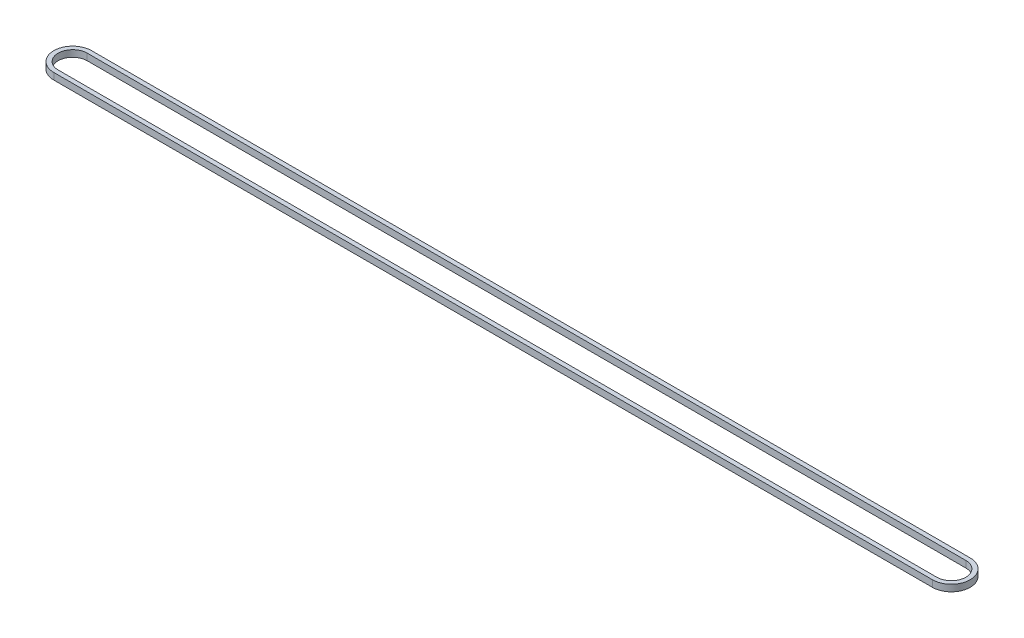
ISO-10303-21;
HEADER;
FILE_DESCRIPTION(('STEP AP214'),'2;1');
FILE_NAME('part.step','',(''),(''),'','','');
FILE_SCHEMA(('AUTOMOTIVE_DESIGN { 1 0 10303 214 1 1 1 1 }'));
ENDSEC;
DATA;
#1=APPLICATION_CONTEXT('core data for automotive mechanical design processes');
#2=APPLICATION_PROTOCOL_DEFINITION('international standard','automotive_design',2000,#1);
#3=PRODUCT_CONTEXT('',#1,'mechanical');
#4=PRODUCT('Part','Part','',(#3));
#5=PRODUCT_RELATED_PRODUCT_CATEGORY('part','',(#4));
#6=PRODUCT_DEFINITION_FORMATION('','',#4);
#7=PRODUCT_DEFINITION_CONTEXT('part definition',#1,'design');
#8=PRODUCT_DEFINITION('design','',#6,#7);
#9=PRODUCT_DEFINITION_SHAPE('','',#8);
#10=(LENGTH_UNIT() NAMED_UNIT(*) SI_UNIT(.MILLI.,.METRE.));
#11=(NAMED_UNIT(*) PLANE_ANGLE_UNIT() SI_UNIT($,.RADIAN.));
#12=(NAMED_UNIT(*) SI_UNIT($,.STERADIAN.) SOLID_ANGLE_UNIT());
#13=UNCERTAINTY_MEASURE_WITH_UNIT(LENGTH_MEASURE(1.E-05),#10,'distance_accuracy_value','');
#14=(GEOMETRIC_REPRESENTATION_CONTEXT(3) GLOBAL_UNCERTAINTY_ASSIGNED_CONTEXT((#13)) GLOBAL_UNIT_ASSIGNED_CONTEXT((#10,
#11,#12)) REPRESENTATION_CONTEXT('',''));
#15=CARTESIAN_POINT('',(0.,0.,0.));
#16=DIRECTION('',(0.,0.,1.));
#17=DIRECTION('',(1.,0.,0.));
#18=AXIS2_PLACEMENT_3D('',#15,#16,#17);
#19=CARTESIAN_POINT('',(0.,8.89,0.));
#20=DIRECTION('',(0.,1.,0.));
#21=DIRECTION('',(0.,0.,1.));
#22=AXIS2_PLACEMENT_3D('',#19,#20,#21);
#23=PLANE('',#22);
#24=CARTESIAN_POINT('',(0.,8.89,0.));
#25=DIRECTION('',(0.,1.,0.));
#26=DIRECTION('',(0.,0.,1.));
#27=AXIS2_PLACEMENT_3D('',#24,#25,#26);
#28=CIRCLE('',#27,25.4);
#29=CARTESIAN_POINT('',(0.,8.89,-25.4));
#30=VERTEX_POINT('',#29);
#31=CARTESIAN_POINT('',(1.74256649143397E-13,8.89,25.4));
#32=VERTEX_POINT('',#31);
#33=EDGE_CURVE('E157',#30,#32,#28,.T.);
#34=ORIENTED_EDGE('',*,*,#33,.T.);
#35=DIRECTION('',(1.,0.,0.));
#36=VECTOR('',#35,1.);
#37=CARTESIAN_POINT('',(1.74256649143397E-13,8.89,25.4));
#38=LINE('',#37,#36);
#39=CARTESIAN_POINT('',(1181.1,8.89,25.3999999999974));
#40=VERTEX_POINT('',#39);
#41=EDGE_CURVE('E161',#32,#40,#38,.T.);
#42=ORIENTED_EDGE('',*,*,#41,.T.);
#43=CARTESIAN_POINT('',(1181.1,8.89,-2.58126853225349E-12));
#44=DIRECTION('',(0.,1.,0.));
#45=DIRECTION('',(0.,0.,-1.));
#46=AXIS2_PLACEMENT_3D('',#43,#44,#45);
#47=CIRCLE('',#46,25.4);
#48=CARTESIAN_POINT('',(1181.1,8.89,-25.4));
#49=VERTEX_POINT('',#48);
#50=EDGE_CURVE('E165',#40,#49,#47,.T.);
#51=ORIENTED_EDGE('',*,*,#50,.T.);
#52=DIRECTION('',(-1.,0.,0.));
#53=VECTOR('',#52,1.);
#54=CARTESIAN_POINT('',(0.,8.89,-25.4));
#55=LINE('',#54,#53);
#56=EDGE_CURVE('E168',#49,#30,#55,.T.);
#57=ORIENTED_EDGE('',*,*,#56,.T.);
#58=EDGE_LOOP('',(#34,#42,#51,#57));
#59=FACE_BOUND('',#58,.T.);
#60=DIRECTION('',(1.,0.,0.));
#61=VECTOR('',#60,1.);
#62=CARTESIAN_POINT('',(1.54217134491906E-13,8.89,19.558));
#63=LINE('',#62,#61);
#64=CARTESIAN_POINT('',(1.54217134491906E-13,8.89,19.558));
#65=VERTEX_POINT('',#64);
#66=CARTESIAN_POINT('',(1181.1,8.89,19.5579999999974));
#67=VERTEX_POINT('',#66);
#68=EDGE_CURVE('E118',#65,#67,#63,.T.);
#69=ORIENTED_EDGE('',*,*,#68,.F.);
#70=CARTESIAN_POINT('',(0.,8.89,0.));
#71=DIRECTION('',(0.,1.,0.));
#72=DIRECTION('',(0.,0.,1.));
#73=AXIS2_PLACEMENT_3D('',#70,#71,#72);
#74=CIRCLE('',#73,19.558);
#75=CARTESIAN_POINT('',(0.,8.89,-19.558));
#76=VERTEX_POINT('',#75);
#77=EDGE_CURVE('E109',#76,#65,#74,.T.);
#78=ORIENTED_EDGE('',*,*,#77,.F.);
#79=DIRECTION('',(-1.,0.,0.));
#80=VECTOR('',#79,1.);
#81=CARTESIAN_POINT('',(0.,8.89,-19.558));
#82=LINE('',#81,#80);
#83=CARTESIAN_POINT('',(1181.1,8.89,-19.5579999999974));
#84=VERTEX_POINT('',#83);
#85=EDGE_CURVE('E135',#84,#76,#82,.T.);
#86=ORIENTED_EDGE('',*,*,#85,.F.);
#87=CARTESIAN_POINT('',(1181.1,8.89,-2.58126853225349E-12));
#88=DIRECTION('',(0.,1.,0.));
#89=DIRECTION('',(0.,0.,-1.));
#90=AXIS2_PLACEMENT_3D('',#87,#88,#89);
#91=CIRCLE('',#90,19.5579999999974);
#92=EDGE_CURVE('E131',#67,#84,#91,.T.);
#93=ORIENTED_EDGE('',*,*,#92,.F.);
#94=EDGE_LOOP('',(#69,#78,#86,#93));
#95=FACE_BOUND('',#94,.T.);
#96=ADVANCED_FACE('F43',(#59,#95),#23,.T.);
#97=CARTESIAN_POINT('',(0.,0.,0.));
#98=DIRECTION('',(0.,1.,0.));
#99=DIRECTION('',(0.,0.,1.));
#100=AXIS2_PLACEMENT_3D('',#97,#98,#99);
#101=PLANE('',#100);
#102=CARTESIAN_POINT('',(0.,0.,0.));
#103=DIRECTION('',(0.,1.,0.));
#104=DIRECTION('',(0.,0.,1.));
#105=AXIS2_PLACEMENT_3D('',#102,#103,#104);
#106=CIRCLE('',#105,25.4);
#107=CARTESIAN_POINT('',(0.,0.,-25.4));
#108=VERTEX_POINT('',#107);
#109=CARTESIAN_POINT('',(1.74256649143397E-13,0.,25.4));
#110=VERTEX_POINT('',#109);
#111=EDGE_CURVE('E127',#108,#110,#106,.T.);
#112=ORIENTED_EDGE('',*,*,#111,.F.);
#113=DIRECTION('',(-1.,0.,0.));
#114=VECTOR('',#113,1.);
#115=CARTESIAN_POINT('',(0.,0.,-25.4));
#116=LINE('',#115,#114);
#117=CARTESIAN_POINT('',(1181.1,0.,-25.4));
#118=VERTEX_POINT('',#117);
#119=EDGE_CURVE('E162',#118,#108,#116,.T.);
#120=ORIENTED_EDGE('',*,*,#119,.F.);
#121=CARTESIAN_POINT('',(1181.1,0.,-2.58126853225349E-12));
#122=DIRECTION('',(0.,1.,0.));
#123=DIRECTION('',(0.,0.,-1.));
#124=AXIS2_PLACEMENT_3D('',#121,#122,#123);
#125=CIRCLE('',#124,25.4);
#126=CARTESIAN_POINT('',(1181.1,0.,25.3999999999974));
#127=VERTEX_POINT('',#126);
#128=EDGE_CURVE('E178',#127,#118,#125,.T.);
#129=ORIENTED_EDGE('',*,*,#128,.F.);
#130=DIRECTION('',(1.,0.,0.));
#131=VECTOR('',#130,1.);
#132=CARTESIAN_POINT('',(1.74256649143397E-13,0.,25.4));
#133=LINE('',#132,#131);
#134=EDGE_CURVE('E175',#110,#127,#133,.T.);
#135=ORIENTED_EDGE('',*,*,#134,.F.);
#136=EDGE_LOOP('',(#112,#120,#129,#135));
#137=FACE_BOUND('',#136,.T.);
#138=CARTESIAN_POINT('',(0.,0.,0.));
#139=DIRECTION('',(0.,1.,0.));
#140=DIRECTION('',(0.,0.,1.));
#141=AXIS2_PLACEMENT_3D('',#138,#139,#140);
#142=CIRCLE('',#141,19.558);
#143=CARTESIAN_POINT('',(0.,0.,-19.558));
#144=VERTEX_POINT('',#143);
#145=CARTESIAN_POINT('',(1.54217134491906E-13,0.,19.558));
#146=VERTEX_POINT('',#145);
#147=EDGE_CURVE('E67',#144,#146,#142,.T.);
#148=ORIENTED_EDGE('',*,*,#147,.T.);
#149=DIRECTION('',(1.,0.,0.));
#150=VECTOR('',#149,1.);
#151=CARTESIAN_POINT('',(1.54217134491906E-13,0.,19.558));
#152=LINE('',#151,#150);
#153=CARTESIAN_POINT('',(1181.1,0.,19.5579999999974));
#154=VERTEX_POINT('',#153);
#155=EDGE_CURVE('E125',#146,#154,#152,.T.);
#156=ORIENTED_EDGE('',*,*,#155,.T.);
#157=CARTESIAN_POINT('',(1181.1,0.,-2.58126853225349E-12));
#158=DIRECTION('',(0.,1.,0.));
#159=DIRECTION('',(0.,0.,-1.));
#160=AXIS2_PLACEMENT_3D('',#157,#158,#159);
#161=CIRCLE('',#160,19.5579999999974);
#162=CARTESIAN_POINT('',(1181.1,0.,-19.558));
#163=VERTEX_POINT('',#162);
#164=EDGE_CURVE('E144',#154,#163,#161,.T.);
#165=ORIENTED_EDGE('',*,*,#164,.T.);
#166=DIRECTION('',(-1.,0.,0.));
#167=VECTOR('',#166,1.);
#168=CARTESIAN_POINT('',(0.,0.,-19.558));
#169=LINE('',#168,#167);
#170=EDGE_CURVE('E119',#163,#144,#169,.T.);
#171=ORIENTED_EDGE('',*,*,#170,.T.);
#172=EDGE_LOOP('',(#148,#156,#165,#171));
#173=FACE_BOUND('',#172,.T.);
#174=ADVANCED_FACE('F201',(#137,#173),#101,.F.);
#175=CARTESIAN_POINT('',(0.,8.89,0.));
#176=DIRECTION('',(0.,-1.,0.));
#177=DIRECTION('',(0.,0.,-1.));
#178=AXIS2_PLACEMENT_3D('',#175,#176,#177);
#179=CYLINDRICAL_SURFACE('',#178,25.4);
#180=ORIENTED_EDGE('',*,*,#111,.T.);
#181=DIRECTION('',(0.,-1.,0.));
#182=VECTOR('',#181,1.);
#183=CARTESIAN_POINT('',(1.74256649143397E-13,8.89,25.4));
#184=LINE('',#183,#182);
#185=EDGE_CURVE('E11',#32,#110,#184,.T.);
#186=ORIENTED_EDGE('',*,*,#185,.F.);
#187=ORIENTED_EDGE('',*,*,#33,.F.);
#188=DIRECTION('',(0.,-1.,0.));
#189=VECTOR('',#188,1.);
#190=CARTESIAN_POINT('',(0.,8.89,-25.4));
#191=LINE('',#190,#189);
#192=EDGE_CURVE('E171',#30,#108,#191,.T.);
#193=ORIENTED_EDGE('',*,*,#192,.T.);
#194=EDGE_LOOP('',(#180,#186,#187,#193));
#195=FACE_BOUND('',#194,.T.);
#196=ADVANCED_FACE('F45',(#195),#179,.T.);
#197=CARTESIAN_POINT('',(1.74256649143397E-13,8.89,25.4));
#198=DIRECTION('',(0.,0.,-1.));
#199=DIRECTION('',(-1.,0.,0.));
#200=AXIS2_PLACEMENT_3D('',#197,#198,#199);
#201=PLANE('',#200);
#202=ORIENTED_EDGE('',*,*,#134,.T.);
#203=DIRECTION('',(0.,-1.,0.));
#204=VECTOR('',#203,1.);
#205=CARTESIAN_POINT('',(1181.1,8.89,25.3999999999974));
#206=LINE('',#205,#204);
#207=EDGE_CURVE('E52',#40,#127,#206,.T.);
#208=ORIENTED_EDGE('',*,*,#207,.F.);
#209=ORIENTED_EDGE('',*,*,#41,.F.);
#210=ORIENTED_EDGE('',*,*,#185,.T.);
#211=EDGE_LOOP('',(#202,#208,#209,#210));
#212=FACE_BOUND('',#211,.T.);
#213=ADVANCED_FACE('F211',(#212),#201,.F.);
#214=CARTESIAN_POINT('',(1181.1,8.89,-2.58126853225349E-12));
#215=DIRECTION('',(0.,-1.,0.));
#216=DIRECTION('',(0.,0.,-1.));
#217=AXIS2_PLACEMENT_3D('',#214,#215,#216);
#218=CYLINDRICAL_SURFACE('',#217,25.4);
#219=ORIENTED_EDGE('',*,*,#128,.T.);
#220=DIRECTION('',(0.,-1.,0.));
#221=VECTOR('',#220,1.);
#222=CARTESIAN_POINT('',(1181.1,8.89,-25.4));
#223=LINE('',#222,#221);
#224=EDGE_CURVE('E186',#49,#118,#223,.T.);
#225=ORIENTED_EDGE('',*,*,#224,.F.);
#226=ORIENTED_EDGE('',*,*,#50,.F.);
#227=ORIENTED_EDGE('',*,*,#207,.T.);
#228=EDGE_LOOP('',(#219,#225,#226,#227));
#229=FACE_BOUND('',#228,.T.);
#230=ADVANCED_FACE('F195',(#229),#218,.T.);
#231=CARTESIAN_POINT('',(0.,8.89,-25.4));
#232=DIRECTION('',(0.,0.,1.));
#233=DIRECTION('',(1.,0.,0.));
#234=AXIS2_PLACEMENT_3D('',#231,#232,#233);
#235=PLANE('',#234);
#236=ORIENTED_EDGE('',*,*,#119,.T.);
#237=ORIENTED_EDGE('',*,*,#192,.F.);
#238=ORIENTED_EDGE('',*,*,#56,.F.);
#239=ORIENTED_EDGE('',*,*,#224,.T.);
#240=EDGE_LOOP('',(#236,#237,#238,#239));
#241=FACE_BOUND('',#240,.T.);
#242=ADVANCED_FACE('F205',(#241),#235,.F.);
#243=CARTESIAN_POINT('',(0.,8.89,0.));
#244=DIRECTION('',(0.,-1.,0.));
#245=DIRECTION('',(0.,0.,-1.));
#246=AXIS2_PLACEMENT_3D('',#243,#244,#245);
#247=CYLINDRICAL_SURFACE('',#246,19.558);
#248=ORIENTED_EDGE('',*,*,#147,.F.);
#249=DIRECTION('',(0.,-1.,0.));
#250=VECTOR('',#249,1.);
#251=CARTESIAN_POINT('',(0.,8.89,-19.558));
#252=LINE('',#251,#250);
#253=EDGE_CURVE('E113',#76,#144,#252,.T.);
#254=ORIENTED_EDGE('',*,*,#253,.F.);
#255=ORIENTED_EDGE('',*,*,#77,.T.);
#256=DIRECTION('',(0.,-1.,0.));
#257=VECTOR('',#256,1.);
#258=CARTESIAN_POINT('',(1.54217134491906E-13,8.89,19.558));
#259=LINE('',#258,#257);
#260=EDGE_CURVE('E112',#65,#146,#259,.T.);
#261=ORIENTED_EDGE('',*,*,#260,.T.);
#262=EDGE_LOOP('',(#248,#254,#255,#261));
#263=FACE_BOUND('',#262,.T.);
#264=ADVANCED_FACE('F111',(#263),#247,.F.);
#265=CARTESIAN_POINT('',(1.54217134491906E-13,8.89,19.558));
#266=DIRECTION('',(0.,0.,-1.));
#267=DIRECTION('',(-1.,0.,0.));
#268=AXIS2_PLACEMENT_3D('',#265,#266,#267);
#269=PLANE('',#268);
#270=ORIENTED_EDGE('',*,*,#155,.F.);
#271=ORIENTED_EDGE('',*,*,#260,.F.);
#272=ORIENTED_EDGE('',*,*,#68,.T.);
#273=DIRECTION('',(0.,-1.,0.));
#274=VECTOR('',#273,1.);
#275=CARTESIAN_POINT('',(1181.1,8.89,19.5579999999974));
#276=LINE('',#275,#274);
#277=EDGE_CURVE('E128',#67,#154,#276,.T.);
#278=ORIENTED_EDGE('',*,*,#277,.T.);
#279=EDGE_LOOP('',(#270,#271,#272,#278));
#280=FACE_BOUND('',#279,.T.);
#281=ADVANCED_FACE('F122',(#280),#269,.T.);
#282=CARTESIAN_POINT('',(1181.1,8.89,-2.58126853225349E-12));
#283=DIRECTION('',(0.,-1.,0.));
#284=DIRECTION('',(0.,0.,-1.));
#285=AXIS2_PLACEMENT_3D('',#282,#283,#284);
#286=CYLINDRICAL_SURFACE('',#285,19.5579999999974);
#287=ORIENTED_EDGE('',*,*,#164,.F.);
#288=ORIENTED_EDGE('',*,*,#277,.F.);
#289=ORIENTED_EDGE('',*,*,#92,.T.);
#290=DIRECTION('',(0.,-1.,0.));
#291=VECTOR('',#290,1.);
#292=CARTESIAN_POINT('',(1181.1,8.89,-19.558));
#293=LINE('',#292,#291);
#294=EDGE_CURVE('E59',#84,#163,#293,.T.);
#295=ORIENTED_EDGE('',*,*,#294,.T.);
#296=EDGE_LOOP('',(#287,#288,#289,#295));
#297=FACE_BOUND('',#296,.T.);
#298=ADVANCED_FACE('F234',(#297),#286,.F.);
#299=CARTESIAN_POINT('',(0.,8.89,-19.558));
#300=DIRECTION('',(0.,0.,1.));
#301=DIRECTION('',(1.,0.,0.));
#302=AXIS2_PLACEMENT_3D('',#299,#300,#301);
#303=PLANE('',#302);
#304=ORIENTED_EDGE('',*,*,#170,.F.);
#305=ORIENTED_EDGE('',*,*,#294,.F.);
#306=ORIENTED_EDGE('',*,*,#85,.T.);
#307=ORIENTED_EDGE('',*,*,#253,.T.);
#308=EDGE_LOOP('',(#304,#305,#306,#307));
#309=FACE_BOUND('',#308,.T.);
#310=ADVANCED_FACE('F238',(#309),#303,.T.);
#311=CLOSED_SHELL('',(#96,#174,#196,#213,#230,#242,#264,#281,#298,#310));
#312=MANIFOLD_SOLID_BREP('B2',#311);
#313=ADVANCED_BREP_SHAPE_REPRESENTATION('',(#18,#312),#14);
#314=SHAPE_DEFINITION_REPRESENTATION(#9,#313);
ENDSEC;
END-ISO-10303-21;
